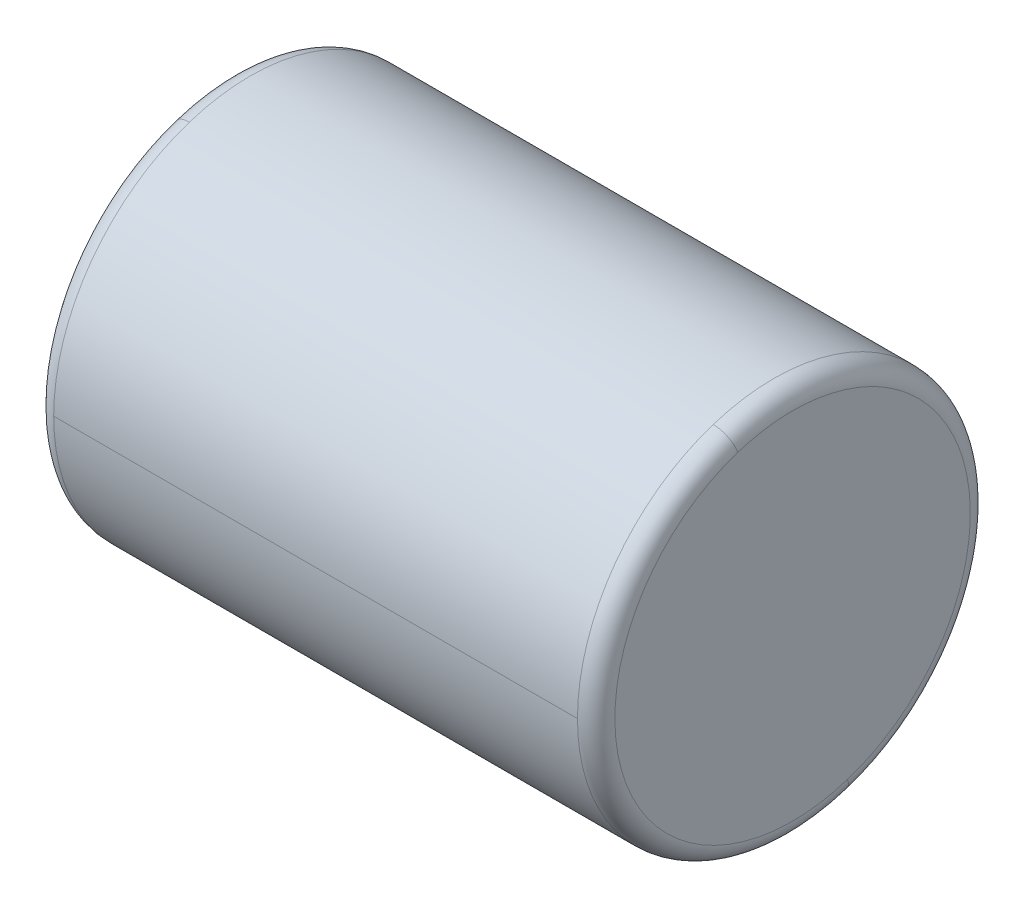
ISO-10303-21;
HEADER;
FILE_DESCRIPTION(('STEP AP214'),'2;1');
FILE_NAME('part.step','',(''),(''),'','','');
FILE_SCHEMA(('AUTOMOTIVE_DESIGN { 1 0 10303 214 1 1 1 1 }'));
ENDSEC;
DATA;
#1=APPLICATION_CONTEXT('core data for automotive mechanical design processes');
#2=APPLICATION_PROTOCOL_DEFINITION('international standard','automotive_design',2000,#1);
#3=PRODUCT_CONTEXT('',#1,'mechanical');
#4=PRODUCT('Part','Part','',(#3));
#5=PRODUCT_RELATED_PRODUCT_CATEGORY('part','',(#4));
#6=PRODUCT_DEFINITION_FORMATION('','',#4);
#7=PRODUCT_DEFINITION_CONTEXT('part definition',#1,'design');
#8=PRODUCT_DEFINITION('design','',#6,#7);
#9=PRODUCT_DEFINITION_SHAPE('','',#8);
#10=(LENGTH_UNIT() NAMED_UNIT(*) SI_UNIT(.MILLI.,.METRE.));
#11=(NAMED_UNIT(*) PLANE_ANGLE_UNIT() SI_UNIT($,.RADIAN.));
#12=(NAMED_UNIT(*) SI_UNIT($,.STERADIAN.) SOLID_ANGLE_UNIT());
#13=UNCERTAINTY_MEASURE_WITH_UNIT(LENGTH_MEASURE(1.E-05),#10,'distance_accuracy_value','');
#14=(GEOMETRIC_REPRESENTATION_CONTEXT(3) GLOBAL_UNCERTAINTY_ASSIGNED_CONTEXT((#13)) GLOBAL_UNIT_ASSIGNED_CONTEXT((#10,
#11,#12)) REPRESENTATION_CONTEXT('',''));
#15=CARTESIAN_POINT('',(0.,0.,0.));
#16=DIRECTION('',(0.,0.,1.));
#17=DIRECTION('',(1.,0.,0.));
#18=AXIS2_PLACEMENT_3D('',#15,#16,#17);
#19=CARTESIAN_POINT('',(3.5,21.3,0.));
#20=DIRECTION('',(1.,0.,0.));
#21=DIRECTION('',(0.,0.,-1.));
#22=AXIS2_PLACEMENT_3D('',#19,#20,#21);
#23=PLANE('',#22);
#24=CARTESIAN_POINT('',(3.5,24.3116789682677,0.978553815520581));
#25=CARTESIAN_POINT('',(3.5,24.2956684480541,1.02783268681269));
#26=CARTESIAN_POINT('',(3.5,24.2784464274029,1.07671781941379));
#27=CARTESIAN_POINT('',(3.5,24.2416253908425,1.17358455536198));
#28=CARTESIAN_POINT('',(3.5,24.2220263749333,1.22156615870908));
#29=CARTESIAN_POINT('',(3.5,24.1804973534747,1.31650978427726));
#30=CARTESIAN_POINT('',(3.5,24.1585673479251,1.36347180649835));
#31=CARTESIAN_POINT('',(3.5,24.1124295027428,1.4562632574427));
#32=CARTESIAN_POINT('',(3.5,24.08822166311,1.50209268616597));
#33=CARTESIAN_POINT('',(3.5,24.0375863816839,1.59250850998114));
#34=CARTESIAN_POINT('',(3.5,24.0111589398906,1.63709490507304));
#35=CARTESIAN_POINT('',(3.5,23.9561481434458,1.72491725794356));
#36=CARTESIAN_POINT('',(3.5,23.9275647887943,1.76815321572218));
#37=CARTESIAN_POINT('',(3.5,23.8683110202002,1.85317053238571));
#38=CARTESIAN_POINT('',(3.5,23.8376406062575,1.89495189127061));
#39=CARTESIAN_POINT('',(3.5,23.7742866084662,1.97695935582888));
#40=CARTESIAN_POINT('',(3.5,23.7416030246175,2.01718546150224));
#41=CARTESIAN_POINT('',(3.5,23.6743014241823,2.09598551125522));
#42=CARTESIAN_POINT('',(3.5,23.6396834075959,2.13455945533485));
#43=CARTESIAN_POINT('',(3.5,23.5685963396394,2.20996225393599));
#44=CARTESIAN_POINT('',(3.5,23.5321272882694,2.24679110845752));
#45=CARTESIAN_POINT('',(3.5,23.4574260078526,2.31861500399389));
#46=CARTESIAN_POINT('',(3.5,23.4191937788059,2.35361004500874));
#47=CARTESIAN_POINT('',(3.5,23.341058247833,2.42168200741601));
#48=CARTESIAN_POINT('',(3.5,23.3011549459067,2.45475892880844));
#49=CARTESIAN_POINT('',(3.5,23.2197733997219,2.51891496676917));
#50=CARTESIAN_POINT('',(3.5,23.1782951554632,2.54999408333748));
#51=CARTESIAN_POINT('',(3.5,23.0938636493377,2.61007963933617));
#52=CARTESIAN_POINT('',(3.5,23.0509103874708,2.63908607876656));
#53=CARTESIAN_POINT('',(3.5,22.9636323242986,2.69495640143612));
#54=CARTESIAN_POINT('',(3.5,22.9193075229933,2.72182028467528));
#55=CARTESIAN_POINT('',(3.5,22.8293931632732,2.77334077751468));
#56=CARTESIAN_POINT('',(3.5,22.7838036048584,2.79799738711491));
#57=CARTESIAN_POINT('',(3.5,22.6914695601585,2.84504393274425));
#58=CARTESIAN_POINT('',(3.5,22.6447250738735,2.86743386877336));
#59=CARTESIAN_POINT('',(3.5,22.550193784995,2.90989312794343));
#60=CARTESIAN_POINT('',(3.5,22.5024069824016,2.92996245108439));
#61=CARTESIAN_POINT('',(3.5,22.4059061834995,2.96773213572085));
#62=CARTESIAN_POINT('',(3.5,22.3571921871907,2.98543249721635));
#63=CARTESIAN_POINT('',(3.5,22.2589543571419,3.01842161684069));
#64=CARTESIAN_POINT('',(3.5,22.2094305234018,3.03371037496952));
#65=CARTESIAN_POINT('',(3.5,22.1096923257435,3.06183945590304));
#66=CARTESIAN_POINT('',(3.5,22.0594779618253,3.07467977870774));
#67=CARTESIAN_POINT('',(3.5,21.9584796746117,3.09788105553067));
#68=CARTESIAN_POINT('',(3.5,21.9076957513164,3.10824200954891));
#69=CARTESIAN_POINT('',(3.5,21.8056806882678,3.12645958835319));
#70=CARTESIAN_POINT('',(3.5,21.7544495485146,3.13431621313923));
#71=CARTESIAN_POINT('',(3.5,21.6516634728534,3.14750620618185));
#72=CARTESIAN_POINT('',(3.5,21.6001085369454,3.15283957443842));
#73=CARTESIAN_POINT('',(3.5,21.4967990693309,3.16097020587083));
#74=CARTESIAN_POINT('',(3.5,21.4450445376243,3.16376746904666));
#75=CARTESIAN_POINT('',(3.5,21.3414605596128,3.16681915146558));
#76=CARTESIAN_POINT('',(3.5,21.2896311133077,3.16707357070867));
#77=CARTESIAN_POINT('',(3.5,21.186022167775,3.16503895234385));
#78=CARTESIAN_POINT('',(3.5,21.1342426685473,3.16274991473595));
#79=CARTESIAN_POINT('',(3.5,21.0308583585184,3.15563389716126));
#80=CARTESIAN_POINT('',(3.5,20.979253547717,3.15080691719447));
#81=CARTESIAN_POINT('',(3.5,20.8763429350501,3.13862664351952));
#82=CARTESIAN_POINT('',(3.5,20.8250371331844,3.13127334981136));
#83=CARTESIAN_POINT('',(3.5,20.7228481385592,3.11405816338231));
#84=CARTESIAN_POINT('',(3.5,20.6719649457997,3.10419627066141));
#85=CARTESIAN_POINT('',(3.5,20.5707437514551,3.08198764437024));
#86=CARTESIAN_POINT('',(3.5,20.52040574987,3.06964091079996));
#87=CARTESIAN_POINT('',(3.5,20.420396206529,3.04249234717264));
#88=CARTESIAN_POINT('',(3.5,20.3707246647732,3.0276905171156));
#89=CARTESIAN_POINT('',(3.5,20.2721677041856,2.99566741941985));
#90=CARTESIAN_POINT('',(3.5,20.2232822853539,2.97844615178114));
#91=CARTESIAN_POINT('',(3.5,20.1264153398703,2.9416256664642));
#92=CARTESIAN_POINT('',(3.5,20.0784338132185,2.92202644878597));
#93=CARTESIAN_POINT('',(3.5,19.9834902437952,2.88049727962206));
#94=CARTESIAN_POINT('',(3.5,19.9365282010236,2.85856732813638));
#95=CARTESIAN_POINT('',(3.5,19.8437367350353,2.81242952253154));
#96=CARTESIAN_POINT('',(3.5,19.7979073118185,2.78822166841239));
#97=CARTESIAN_POINT('',(3.5,19.7074914920344,2.73758637638152));
#98=CARTESIAN_POINT('',(3.5,19.662905095467,2.71115893846981));
#99=CARTESIAN_POINT('',(3.5,19.5750827415164,2.65614814486654));
#100=CARTESIAN_POINT('',(3.5,19.5318467841331,2.62756478917499));
#101=CARTESIAN_POINT('',(3.5,19.446829467759,2.56831101981949));
#102=CARTESIAN_POINT('',(3.5,19.4050481087682,2.53764060615554));
#103=CARTESIAN_POINT('',(3.5,19.3230406441323,2.47428660856821));
#104=CARTESIAN_POINT('',(3.5,19.2828145384874,2.44160302464481));
#105=CARTESIAN_POINT('',(3.5,19.2040144887552,2.37430142415497));
#106=CARTESIAN_POINT('',(3.5,19.1654405446679,2.33968340758854));
#107=CARTESIAN_POINT('',(3.5,19.0900377460612,2.26859633964671));
#108=CARTESIAN_POINT('',(3.5,19.0532088915417,2.23212728827132));
#109=CARTESIAN_POINT('',(3.5,18.9813849960069,2.15742600785067));
#110=CARTESIAN_POINT('',(3.5,18.9463899549915,2.1191937788054));
#111=CARTESIAN_POINT('',(3.5,18.8783179925838,2.04105824783351));
#112=CARTESIAN_POINT('',(3.5,18.8452410711915,2.00115494590688));
#113=CARTESIAN_POINT('',(3.5,18.7810850332309,1.91977339972173));
#114=CARTESIAN_POINT('',(3.5,18.7500059166625,1.87829515546321));
#115=CARTESIAN_POINT('',(3.5,18.6899203606638,1.79386364933774));
#116=CARTESIAN_POINT('',(3.5,18.6609139212334,1.75091038747079));
#117=CARTESIAN_POINT('',(3.5,18.6050435985639,1.66363232429859));
#118=CARTESIAN_POINT('',(3.5,18.5781797153247,1.61930752299333));
#119=CARTESIAN_POINT('',(3.5,18.5266592224853,1.52939316327322));
#120=CARTESIAN_POINT('',(3.5,18.5020026128851,1.48380360485838));
#121=CARTESIAN_POINT('',(3.5,18.4549560672557,1.39146956015851));
#122=CARTESIAN_POINT('',(3.5,18.4325661312266,1.34472507387349));
#123=CARTESIAN_POINT('',(3.5,18.3901068720566,1.25019378499504));
#124=CARTESIAN_POINT('',(3.5,18.3700375489156,1.20240698240162));
#125=CARTESIAN_POINT('',(3.5,18.3322678642792,1.10590618349948));
#126=CARTESIAN_POINT('',(3.5,18.3145675027837,1.05719218719075));
#127=CARTESIAN_POINT('',(3.5,18.2815783831593,0.958954357141904));
#128=CARTESIAN_POINT('',(3.5,18.2662896250303,0.909430523401779));
#129=CARTESIAN_POINT('',(3.5,18.2381605440971,0.809692325743558));
#130=CARTESIAN_POINT('',(3.5,18.2253202212928,0.759477961825463));
#131=CARTESIAN_POINT('',(3.5,18.2021189444688,0.65847967461159));
#132=CARTESIAN_POINT('',(3.5,18.1917579904491,0.607695751315812));
#133=CARTESIAN_POINT('',(3.5,18.1735404116488,0.505680688268356));
#134=CARTESIAN_POINT('',(3.5,18.1656837868683,0.454449548516679));
#135=CARTESIAN_POINT('',(3.5,18.1524937938106,0.35166347285139));
#136=CARTESIAN_POINT('',(3.5,18.1471604255334,0.300108536937779));
#137=CARTESIAN_POINT('',(3.5,18.1390297941574,0.196799069338551));
#138=CARTESIAN_POINT('',(3.5,18.1362325310586,0.145044537652935));
#139=CARTESIAN_POINT('',(3.5,18.1331808484291,0.0414605595841703));
#140=CARTESIAN_POINT('',(3.5,18.1329264288983,-0.0103688867989791));
#141=CARTESIAN_POINT('',(3.5,18.1349610480492,-0.113977832118299));
#142=CARTESIAN_POINT('',(3.5,18.1372500867309,-0.16575733105447));
#143=CARTESIAN_POINT('',(3.5,18.1443661013719,-0.269141641879834));
#144=CARTESIAN_POINT('',(3.5,18.1491930773311,-0.320746453769028));
#145=CARTESIAN_POINT('',(3.5,18.1613733619549,-0.423657063463854));
#146=CARTESIAN_POINT('',(3.5,18.1687266706194,-0.474962861269486));
#147=CARTESIAN_POINT('',(3.5,18.1859418161869,-0.577151866986909));
#148=CARTESIAN_POINT('',(3.5,18.19580365309,-0.628035074898699));
#149=CARTESIAN_POINT('',(3.5,18.2180124318783,-0.729256227846476));
#150=CARTESIAN_POINT('',(3.5,18.2303593737636,-0.779594172882464));
#151=CARTESIAN_POINT('',(3.5,18.2575073682638,-0.879603870718502));
#152=CARTESIAN_POINT('',(3.5,18.2723084208787,-0.929275623518553));
#153=CARTESIAN_POINT('',(3.5,18.2883210317323,-0.97855381552057));
#154=B_SPLINE_CURVE_WITH_KNOTS('',3,(#24,#25,#26,#27,#28,#29,#30,#31,#32,#33,#34,#35,#36,#37,
#38,#39,#40,#41,#42,#43,#44,#45,#46,#47,#48,#49,#50,#51,#52,#53,#54,#55,#56,#57,#58,#59,#60,#61,
#62,#63,#64,#65,#66,#67,#68,#69,#70,#71,#72,#73,#74,#75,#76,#77,#78,#79,#80,#81,#82,#83,#84,#85,
#86,#87,#88,#89,#90,#91,#92,#93,#94,#95,#96,#97,#98,#99,#100,#101,#102,#103,#104,#105,#106,#107,
#108,#109,#110,#111,#112,#113,#114,#115,#116,#117,#118,#119,#120,#121,#122,#123,#124,#125,#126,
#127,#128,#129,#130,#131,#132,#133,#134,#135,#136,#137,#138,#139,#140,#141,#142,#143,#144,#145,
#146,#147,#148,#149,#150,#151,#152,#153),.UNSPECIFIED.,.F.,.F.,(4,2,2,2,2,2,2,2,2,2,2,2,2,2,2,2,
2,2,2,2,2,2,2,2,2,2,2,2,2,2,2,2,2,2,2,2,2,2,2,2,2,2,2,2,2,2,2,2,2,2,2,2,2,2,2,2,2,2,2,2,2,2,2,2,
4),(0.,0.155427780645098,0.310855561290195,0.466283341935292,0.62171112258039,0.777138903225486,
0.932566683870585,1.08799446451568,1.24342224516078,1.39885002580588,1.55427780645097,
1.70970558709607,1.86513336774117,2.02056114838627,2.17598892903136,2.33141670967646,
2.48684449032156,2.64227227096665,2.79770005161175,2.95312783225685,3.10855561290195,
3.26398339354704,3.41941117419214,3.57483895483724,3.73026673548234,3.88569451612744,
4.04112229677253,4.19655007741763,4.35197785806272,4.50740563870782,4.66283341935292,
4.81826119999802,4.97368898064311,5.12911676128821,5.28454454193331,5.4399723225784,
5.59540010322351,5.7508278838686,5.9062556645137,6.0616834451588,6.21711122580389,
6.37253900644899,6.52796678709409,6.68339456773919,6.83882234838428,6.99425012902938,
7.14967790967448,7.30510569031957,7.46053347096467,7.61596125160977,7.77138903225487,
7.92681681289996,8.08224459354506,8.23767237419016,8.39310015483526,8.54852793548035,
8.70395571612545,8.85938349677055,9.01481127741565,9.17023905806074,9.32566683870584,
9.48109461935094,9.63652239999603,9.79195018064113,9.94737796128623),.UNSPECIFIED.);
#155=CARTESIAN_POINT('',(3.5,24.3116789682677,0.978553815520581));
#156=VERTEX_POINT('',#155);
#157=CARTESIAN_POINT('',(3.5,18.2883210317323,-0.97855381552058));
#158=VERTEX_POINT('',#157);
#159=EDGE_CURVE('E11',#156,#158,#154,.T.);
#160=ORIENTED_EDGE('',*,*,#159,.F.);
#161=CARTESIAN_POINT('',(3.5,18.2883210317323,-0.978553815520581));
#162=CARTESIAN_POINT('',(3.5,18.3043315519459,-1.02783268681269));
#163=CARTESIAN_POINT('',(3.5,18.3215535725971,-1.07671781941379));
#164=CARTESIAN_POINT('',(3.5,18.3583746091575,-1.17358455536198));
#165=CARTESIAN_POINT('',(3.5,18.3779736250667,-1.22156615870908));
#166=CARTESIAN_POINT('',(3.5,18.4195026465253,-1.31650978427726));
#167=CARTESIAN_POINT('',(3.5,18.4414326520749,-1.36347180649835));
#168=CARTESIAN_POINT('',(3.5,18.4875704972572,-1.4562632574427));
#169=CARTESIAN_POINT('',(3.5,18.51177833689,-1.50209268616597));
#170=CARTESIAN_POINT('',(3.5,18.5624136183161,-1.59250850998114));
#171=CARTESIAN_POINT('',(3.5,18.5888410601094,-1.63709490507304));
#172=CARTESIAN_POINT('',(3.5,18.6438518565542,-1.72491725794356));
#173=CARTESIAN_POINT('',(3.5,18.6724352112057,-1.76815321572218));
#174=CARTESIAN_POINT('',(3.5,18.7316889797998,-1.85317053238571));
#175=CARTESIAN_POINT('',(3.5,18.7623593937425,-1.89495189127061));
#176=CARTESIAN_POINT('',(3.5,18.8257133915338,-1.97695935582888));
#177=CARTESIAN_POINT('',(3.5,18.8583969753825,-2.01718546150224));
#178=CARTESIAN_POINT('',(3.5,18.9256985758177,-2.09598551125522));
#179=CARTESIAN_POINT('',(3.5,18.9603165924041,-2.13455945533484));
#180=CARTESIAN_POINT('',(3.5,19.0314036603606,-2.20996225393599));
#181=CARTESIAN_POINT('',(3.5,19.0678727117306,-2.24679110845752));
#182=CARTESIAN_POINT('',(3.5,19.1425739921474,-2.31861500399389));
#183=CARTESIAN_POINT('',(3.5,19.1808062211941,-2.35361004500874));
#184=CARTESIAN_POINT('',(3.5,19.258941752167,-2.42168200741601));
#185=CARTESIAN_POINT('',(3.5,19.2988450540933,-2.45475892880844));
#186=CARTESIAN_POINT('',(3.5,19.3802266002781,-2.51891496676917));
#187=CARTESIAN_POINT('',(3.5,19.4217048445368,-2.54999408333747));
#188=CARTESIAN_POINT('',(3.5,19.5061363506623,-2.61007963933617));
#189=CARTESIAN_POINT('',(3.5,19.5490896125292,-2.63908607876656));
#190=CARTESIAN_POINT('',(3.5,19.6363676757014,-2.69495640143612));
#191=CARTESIAN_POINT('',(3.5,19.6806924770067,-2.72182028467528));
#192=CARTESIAN_POINT('',(3.5,19.7706068367268,-2.77334077751468));
#193=CARTESIAN_POINT('',(3.5,19.8161963951416,-2.79799738711491));
#194=CARTESIAN_POINT('',(3.5,19.9085304398415,-2.84504393274425));
#195=CARTESIAN_POINT('',(3.5,19.9552749261265,-2.86743386877336));
#196=CARTESIAN_POINT('',(3.5,20.049806215005,-2.90989312794343));
#197=CARTESIAN_POINT('',(3.5,20.0975930175984,-2.92996245108439));
#198=CARTESIAN_POINT('',(3.5,20.1940938165005,-2.96773213572085));
#199=CARTESIAN_POINT('',(3.5,20.2428078128093,-2.98543249721635));
#200=CARTESIAN_POINT('',(3.5,20.3410456428581,-3.01842161684069));
#201=CARTESIAN_POINT('',(3.5,20.3905694765982,-3.03371037496952));
#202=CARTESIAN_POINT('',(3.5,20.4903076742565,-3.06183945590304));
#203=CARTESIAN_POINT('',(3.5,20.5405220381747,-3.07467977870774));
#204=CARTESIAN_POINT('',(3.5,20.6415203253883,-3.09788105553067));
#205=CARTESIAN_POINT('',(3.5,20.6923042486836,-3.10824200954891));
#206=CARTESIAN_POINT('',(3.5,20.7943193117322,-3.12645958835319));
#207=CARTESIAN_POINT('',(3.5,20.8455504514854,-3.13431621313923));
#208=CARTESIAN_POINT('',(3.5,20.9483365271466,-3.14750620618185));
#209=CARTESIAN_POINT('',(3.5,20.9998914630546,-3.15283957443842));
#210=CARTESIAN_POINT('',(3.5,21.1032009306691,-3.16097020587083));
#211=CARTESIAN_POINT('',(3.5,21.1549554623757,-3.16376746904666));
#212=CARTESIAN_POINT('',(3.5,21.2585394403872,-3.16681915146558));
#213=CARTESIAN_POINT('',(3.5,21.3103688866923,-3.16707357070867));
#214=CARTESIAN_POINT('',(3.5,21.413977832225,-3.16503895234385));
#215=CARTESIAN_POINT('',(3.5,21.4657573314527,-3.16274991473595));
#216=CARTESIAN_POINT('',(3.5,21.5691416414816,-3.15563389716126));
#217=CARTESIAN_POINT('',(3.5,21.620746452283,-3.15080691719447));
#218=CARTESIAN_POINT('',(3.5,21.7236570649499,-3.13862664351952));
#219=CARTESIAN_POINT('',(3.5,21.7749628668156,-3.13127334981136));
#220=CARTESIAN_POINT('',(3.5,21.8771518614408,-3.11405816338231));
#221=CARTESIAN_POINT('',(3.5,21.9280350542003,-3.10419627066141));
#222=CARTESIAN_POINT('',(3.5,22.0292562485449,-3.08198764437024));
#223=CARTESIAN_POINT('',(3.5,22.07959425013,-3.06964091079996));
#224=CARTESIAN_POINT('',(3.5,22.179603793471,-3.04249234717264));
#225=CARTESIAN_POINT('',(3.5,22.2292753352268,-3.0276905171156));
#226=CARTESIAN_POINT('',(3.5,22.3278322958144,-2.99566741941985));
#227=CARTESIAN_POINT('',(3.5,22.3767177146461,-2.97844615178114));
#228=CARTESIAN_POINT('',(3.5,22.4735846601297,-2.9416256664642));
#229=CARTESIAN_POINT('',(3.5,22.5215661867815,-2.92202644878597));
#230=CARTESIAN_POINT('',(3.5,22.6165097562048,-2.88049727962206));
#231=CARTESIAN_POINT('',(3.5,22.6634717989764,-2.85856732813638));
#232=CARTESIAN_POINT('',(3.5,22.7562632649647,-2.81242952253154));
#233=CARTESIAN_POINT('',(3.5,22.8020926881815,-2.78822166841239));
#234=CARTESIAN_POINT('',(3.5,22.8925085079656,-2.73758637638152));
#235=CARTESIAN_POINT('',(3.5,22.937094904533,-2.71115893846981));
#236=CARTESIAN_POINT('',(3.5,23.0249172584836,-2.65614814486655));
#237=CARTESIAN_POINT('',(3.5,23.0681532158669,-2.62756478917499));
#238=CARTESIAN_POINT('',(3.5,23.153170532241,-2.56831101981949));
#239=CARTESIAN_POINT('',(3.5,23.1949518912318,-2.53764060615555));
#240=CARTESIAN_POINT('',(3.5,23.2769593558676,-2.47428660856821));
#241=CARTESIAN_POINT('',(3.5,23.3171854615126,-2.44160302464481));
#242=CARTESIAN_POINT('',(3.5,23.3959855112448,-2.37430142415498));
#243=CARTESIAN_POINT('',(3.5,23.434559455332,-2.33968340758854));
#244=CARTESIAN_POINT('',(3.5,23.5099622539388,-2.26859633964671));
#245=CARTESIAN_POINT('',(3.5,23.5467911084583,-2.23212728827132));
#246=CARTESIAN_POINT('',(3.5,23.6186150039931,-2.15742600785067));
#247=CARTESIAN_POINT('',(3.5,23.6536100450085,-2.1191937788054));
#248=CARTESIAN_POINT('',(3.5,23.7216820074162,-2.04105824783351));
#249=CARTESIAN_POINT('',(3.5,23.7547589288085,-2.00115494590689));
#250=CARTESIAN_POINT('',(3.5,23.8189149667691,-1.91977339972174));
#251=CARTESIAN_POINT('',(3.5,23.8499940833374,-1.87829515546321));
#252=CARTESIAN_POINT('',(3.5,23.9100796393362,-1.79386364933774));
#253=CARTESIAN_POINT('',(3.5,23.9390860787666,-1.7509103874708));
#254=CARTESIAN_POINT('',(3.5,23.9949564014361,-1.66363232429859));
#255=CARTESIAN_POINT('',(3.5,24.0218202846753,-1.61930752299333));
#256=CARTESIAN_POINT('',(3.5,24.0733407775147,-1.52939316327323));
#257=CARTESIAN_POINT('',(3.5,24.0979973871149,-1.48380360485839));
#258=CARTESIAN_POINT('',(3.5,24.1450439327442,-1.39146956015852));
#259=CARTESIAN_POINT('',(3.5,24.1674338687734,-1.34472507387349));
#260=CARTESIAN_POINT('',(3.5,24.2098931279434,-1.25019378499504));
#261=CARTESIAN_POINT('',(3.5,24.2299624510844,-1.20240698240162));
#262=CARTESIAN_POINT('',(3.5,24.2677321357208,-1.10590618349948));
#263=CARTESIAN_POINT('',(3.5,24.2854324972163,-1.05719218719076));
#264=CARTESIAN_POINT('',(3.5,24.3184216168407,-0.958954357141908));
#265=CARTESIAN_POINT('',(3.5,24.3337103749697,-0.909430523401784));
#266=CARTESIAN_POINT('',(3.5,24.3618394559029,-0.809692325743563));
#267=CARTESIAN_POINT('',(3.5,24.3746797787072,-0.759477961825467));
#268=CARTESIAN_POINT('',(3.5,24.3978810555312,-0.658479674611594));
#269=CARTESIAN_POINT('',(3.5,24.4082420095509,-0.607695751315816));
#270=CARTESIAN_POINT('',(3.5,24.4264595883512,-0.505680688268361));
#271=CARTESIAN_POINT('',(3.5,24.4343162131317,-0.454449548516683));
#272=CARTESIAN_POINT('',(3.5,24.4475062061894,-0.351663472851395));
#273=CARTESIAN_POINT('',(3.5,24.4528395744666,-0.300108536937784));
#274=CARTESIAN_POINT('',(3.5,24.4609702058426,-0.196799069338557));
#275=CARTESIAN_POINT('',(3.5,24.4637674689413,-0.145044537652941));
#276=CARTESIAN_POINT('',(3.5,24.4668191515709,-0.0414605595841764));
#277=CARTESIAN_POINT('',(3.5,24.4670735711017,0.010368886798973));
#278=CARTESIAN_POINT('',(3.5,24.4650389519508,0.113977832118293));
#279=CARTESIAN_POINT('',(3.5,24.4627499132691,0.165757331054464));
#280=CARTESIAN_POINT('',(3.5,24.4556338986281,0.269141641879828));
#281=CARTESIAN_POINT('',(3.5,24.4508069226689,0.320746453769022));
#282=CARTESIAN_POINT('',(3.5,24.4386266380451,0.423657063463849));
#283=CARTESIAN_POINT('',(3.5,24.4312733293806,0.474962861269483));
#284=CARTESIAN_POINT('',(3.5,24.4140581838131,0.577151866986906));
#285=CARTESIAN_POINT('',(3.5,24.40419634691,0.628035074898696));
#286=CARTESIAN_POINT('',(3.5,24.3819875681217,0.729256227846473));
#287=CARTESIAN_POINT('',(3.5,24.3696406262364,0.77959417288246));
#288=CARTESIAN_POINT('',(3.5,24.3424926317362,0.879603870718498));
#289=CARTESIAN_POINT('',(3.5,24.3276915791213,0.929275623518549));
#290=CARTESIAN_POINT('',(3.5,24.3116789682677,0.978553815520564));
#291=B_SPLINE_CURVE_WITH_KNOTS('',3,(#161,#162,#163,#164,#165,#166,#167,#168,#169,#170,#171,
#172,#173,#174,#175,#176,#177,#178,#179,#180,#181,#182,#183,#184,#185,#186,#187,#188,#189,#190,
#191,#192,#193,#194,#195,#196,#197,#198,#199,#200,#201,#202,#203,#204,#205,#206,#207,#208,#209,
#210,#211,#212,#213,#214,#215,#216,#217,#218,#219,#220,#221,#222,#223,#224,#225,#226,#227,#228,
#229,#230,#231,#232,#233,#234,#235,#236,#237,#238,#239,#240,#241,#242,#243,#244,#245,#246,#247,
#248,#249,#250,#251,#252,#253,#254,#255,#256,#257,#258,#259,#260,#261,#262,#263,#264,#265,#266,
#267,#268,#269,#270,#271,#272,#273,#274,#275,#276,#277,#278,#279,#280,#281,#282,#283,#284,#285,
#286,#287,#288,#289,#290),.UNSPECIFIED.,.F.,.F.,(4,2,2,2,2,2,2,2,2,2,2,2,2,2,2,2,2,2,2,2,2,2,2,
2,2,2,2,2,2,2,2,2,2,2,2,2,2,2,2,2,2,2,2,2,2,2,2,2,2,2,2,2,2,2,2,2,2,2,2,2,2,2,2,2,4),(0.,
0.155427780645098,0.310855561290195,0.466283341935291,0.62171112258039,0.777138903225486,
0.932566683870583,1.08799446451568,1.24342224516078,1.39885002580588,1.55427780645097,
1.70970558709607,1.86513336774117,2.02056114838627,2.17598892903136,2.33141670967646,
2.48684449032156,2.64227227096665,2.79770005161175,2.95312783225685,3.10855561290195,
3.26398339354704,3.41941117419214,3.57483895483724,3.73026673548233,3.88569451612743,
4.04112229677253,4.19655007741763,4.35197785806272,4.50740563870782,4.66283341935292,
4.81826119999802,4.97368898064311,5.12911676128821,5.28454454193331,5.43997232257841,
5.5954001032235,5.7508278838686,5.9062556645137,6.0616834451588,6.21711122580389,
6.37253900644899,6.52796678709409,6.68339456773918,6.83882234838428,6.99425012902938,
7.14967790967447,7.30510569031957,7.46053347096467,7.61596125160977,7.77138903225486,
7.92681681289996,8.08224459354506,8.23767237419015,8.39310015483525,8.54852793548035,
8.70395571612544,8.85938349677054,9.01481127741564,9.17023905806074,9.32566683870583,
9.48109461935093,9.63652239999603,9.79195018064113,9.94737796128622),.UNSPECIFIED.);
#292=EDGE_CURVE('E26',#158,#156,#291,.T.);
#293=ORIENTED_EDGE('',*,*,#292,.F.);
#294=EDGE_LOOP('',(#160,#293));
#295=FACE_BOUND('',#294,.T.);
#296=ADVANCED_FACE('F17',(#295),#23,.F.);
#297=CARTESIAN_POINT('',(3.83333333333362,21.3,0.));
#298=DIRECTION('',(1.,0.,0.));
#299=DIRECTION('',(0.,-0.309016994374947,0.951056516295154));
#300=AXIS2_PLACEMENT_3D('',#297,#298,#299);
#301=TOROIDAL_SURFACE('',#300,3.16666666666639,0.333333333333613);
#302=CARTESIAN_POINT('',(3.83333333333362,18.2883210317323,-0.978553815520581));
#303=DIRECTION('',(0.,0.309016994374946,-0.951056516295154));
#304=DIRECTION('',(-9.47242284609388E-13,-0.951056516295154,-0.309016994374946));
#305=AXIS2_PLACEMENT_3D('',#302,#303,#304);
#306=CIRCLE('',#305,0.333333333333613);
#307=CARTESIAN_POINT('',(3.8333333333333,17.971302192967,-1.08155948031232));
#308=VERTEX_POINT('',#307);
#309=EDGE_CURVE('E139',#308,#158,#306,.T.);
#310=ORIENTED_EDGE('',*,*,#309,.T.);
#311=ORIENTED_EDGE('',*,*,#292,.T.);
#312=CARTESIAN_POINT('',(3.83333333333362,24.3116789682677,0.978553815520581));
#313=DIRECTION('',(0.,-0.309016994374947,0.951056516295154));
#314=DIRECTION('',(-9.45910016979839E-13,0.951056516295154,0.309016994374947));
#315=AXIS2_PLACEMENT_3D('',#312,#313,#314);
#316=CIRCLE('',#315,0.333333333333613);
#317=CARTESIAN_POINT('',(3.8333333333333,24.628697807033,1.08155948031232));
#318=VERTEX_POINT('',#317);
#319=EDGE_CURVE('E135',#318,#156,#316,.T.);
#320=ORIENTED_EDGE('',*,*,#319,.F.);
#321=CARTESIAN_POINT('',(3.8333333333333,21.3,0.));
#322=DIRECTION('',(1.,0.,0.));
#323=DIRECTION('',(0.,0.,-1.));
#324=AXIS2_PLACEMENT_3D('',#321,#322,#323);
#325=CIRCLE('',#324,3.5);
#326=CARTESIAN_POINT('',(3.8333333333333,21.3,-3.5));
#327=VERTEX_POINT('',#326);
#328=EDGE_CURVE('E130',#327,#318,#325,.T.);
#329=ORIENTED_EDGE('',*,*,#328,.F.);
#330=CARTESIAN_POINT('',(3.8333333333333,21.3,0.));
#331=DIRECTION('',(1.,0.,0.));
#332=DIRECTION('',(0.,0.,-1.));
#333=AXIS2_PLACEMENT_3D('',#330,#331,#332);
#334=CIRCLE('',#333,3.5);
#335=EDGE_CURVE('E125',#308,#327,#334,.T.);
#336=ORIENTED_EDGE('',*,*,#335,.F.);
#337=EDGE_LOOP('',(#310,#311,#320,#329,#336));
#338=FACE_BOUND('',#337,.T.);
#339=ADVANCED_FACE('F146',(#338),#301,.T.);
#340=CARTESIAN_POINT('',(13.5,21.3,0.));
#341=DIRECTION('',(1.,0.,0.));
#342=DIRECTION('',(0.,1.,0.));
#343=AXIS2_PLACEMENT_3D('',#340,#341,#342);
#344=CYLINDRICAL_SURFACE('',#343,3.5);
#345=DIRECTION('',(1.,0.,0.));
#346=VECTOR('',#345,1.);
#347=CARTESIAN_POINT('',(3.8333333333333,21.3,3.5));
#348=LINE('',#347,#346);
#349=CARTESIAN_POINT('',(3.8333333333333,21.3,3.5));
#350=VERTEX_POINT('',#349);
#351=CARTESIAN_POINT('',(13.166666666667,21.3,3.5));
#352=VERTEX_POINT('',#351);
#353=EDGE_CURVE('E92',#350,#352,#348,.T.);
#354=ORIENTED_EDGE('',*,*,#353,.F.);
#355=CARTESIAN_POINT('',(3.8333333333333,21.3,0.));
#356=DIRECTION('',(1.,0.,0.));
#357=DIRECTION('',(0.,0.,-1.));
#358=AXIS2_PLACEMENT_3D('',#355,#356,#357);
#359=CIRCLE('',#358,3.5);
#360=EDGE_CURVE('E117',#350,#308,#359,.T.);
#361=ORIENTED_EDGE('',*,*,#360,.T.);
#362=ORIENTED_EDGE('',*,*,#335,.T.);
#363=DIRECTION('',(1.,0.,0.));
#364=VECTOR('',#363,1.);
#365=CARTESIAN_POINT('',(3.8333333333333,21.3,-3.5));
#366=LINE('',#365,#364);
#367=CARTESIAN_POINT('',(13.166666666667,21.3,-3.5));
#368=VERTEX_POINT('',#367);
#369=EDGE_CURVE('E113',#327,#368,#366,.T.);
#370=ORIENTED_EDGE('',*,*,#369,.T.);
#371=CARTESIAN_POINT('',(13.166666666667,21.3,0.));
#372=DIRECTION('',(1.,0.,0.));
#373=DIRECTION('',(0.,0.,-1.));
#374=AXIS2_PLACEMENT_3D('',#371,#372,#373);
#375=CIRCLE('',#374,3.5);
#376=CARTESIAN_POINT('',(13.166666666667,17.971302192967,-1.08155948031232));
#377=VERTEX_POINT('',#376);
#378=EDGE_CURVE('E84',#377,#368,#375,.T.);
#379=ORIENTED_EDGE('',*,*,#378,.F.);
#380=CARTESIAN_POINT('',(13.166666666667,21.3,0.));
#381=DIRECTION('',(1.,0.,0.));
#382=DIRECTION('',(0.,0.,-1.));
#383=AXIS2_PLACEMENT_3D('',#380,#381,#382);
#384=CIRCLE('',#383,3.5);
#385=EDGE_CURVE('E106',#352,#377,#384,.T.);
#386=ORIENTED_EDGE('',*,*,#385,.F.);
#387=EDGE_LOOP('',(#354,#361,#362,#370,#379,#386));
#388=FACE_BOUND('',#387,.T.);
#389=ADVANCED_FACE('F155',(#388),#344,.T.);
#390=CARTESIAN_POINT('',(13.166666666666,21.3,0.));
#391=DIRECTION('',(1.,0.,0.));
#392=DIRECTION('',(0.,0.309016994374947,-0.951056516295154));
#393=AXIS2_PLACEMENT_3D('',#390,#391,#392);
#394=TOROIDAL_SURFACE('',#393,3.16666666666605,0.333333333333956);
#395=CARTESIAN_POINT('',(13.166666666666,18.2883210317326,-0.978553815520476));
#396=DIRECTION('',(0.,0.309016994374947,-0.951056516295154));
#397=DIRECTION('',(1.,0.,0.));
#398=AXIS2_PLACEMENT_3D('',#395,#396,#397);
#399=CIRCLE('',#398,0.333333333333956);
#400=CARTESIAN_POINT('',(13.5,18.2883210317326,-0.978553815520476));
#401=VERTEX_POINT('',#400);
#402=EDGE_CURVE('E102',#401,#377,#399,.T.);
#403=ORIENTED_EDGE('',*,*,#402,.F.);
#404=CARTESIAN_POINT('',(13.5,21.3,0.));
#405=DIRECTION('',(1.,0.,0.));
#406=DIRECTION('',(0.,0.,-1.));
#407=AXIS2_PLACEMENT_3D('',#404,#405,#406);
#408=CIRCLE('',#407,3.166666666667);
#409=CARTESIAN_POINT('',(13.5,24.3116789682674,0.978553815520476));
#410=VERTEX_POINT('',#409);
#411=EDGE_CURVE('E74',#410,#401,#408,.T.);
#412=ORIENTED_EDGE('',*,*,#411,.F.);
#413=CARTESIAN_POINT('',(13.166666666666,24.3116789682674,0.978553815520476));
#414=DIRECTION('',(0.,-0.309016994374947,0.951056516295154));
#415=DIRECTION('',(1.,0.,0.));
#416=AXIS2_PLACEMENT_3D('',#413,#414,#415);
#417=CIRCLE('',#416,0.333333333333956);
#418=CARTESIAN_POINT('',(13.166666666667,24.628697807033,1.08155948031232));
#419=VERTEX_POINT('',#418);
#420=EDGE_CURVE('E67',#410,#419,#417,.T.);
#421=ORIENTED_EDGE('',*,*,#420,.T.);
#422=CARTESIAN_POINT('',(13.166666666667,21.3,0.));
#423=DIRECTION('',(1.,0.,0.));
#424=DIRECTION('',(0.,0.,-1.));
#425=AXIS2_PLACEMENT_3D('',#422,#423,#424);
#426=CIRCLE('',#425,3.5);
#427=EDGE_CURVE('E72',#419,#352,#426,.T.);
#428=ORIENTED_EDGE('',*,*,#427,.T.);
#429=ORIENTED_EDGE('',*,*,#385,.T.);
#430=EDGE_LOOP('',(#403,#412,#421,#428,#429));
#431=FACE_BOUND('',#430,.T.);
#432=ADVANCED_FACE('F69',(#431),#394,.T.);
#433=CARTESIAN_POINT('',(13.5,21.3,0.));
#434=DIRECTION('',(1.,0.,0.));
#435=DIRECTION('',(0.,-1.,0.));
#436=AXIS2_PLACEMENT_3D('',#433,#434,#435);
#437=CYLINDRICAL_SURFACE('',#436,3.5);
#438=ORIENTED_EDGE('',*,*,#353,.T.);
#439=ORIENTED_EDGE('',*,*,#427,.F.);
#440=CARTESIAN_POINT('',(13.166666666667,21.3,0.));
#441=DIRECTION('',(1.,0.,0.));
#442=DIRECTION('',(0.,0.,-1.));
#443=AXIS2_PLACEMENT_3D('',#440,#441,#442);
#444=CIRCLE('',#443,3.5);
#445=EDGE_CURVE('E81',#368,#419,#444,.T.);
#446=ORIENTED_EDGE('',*,*,#445,.F.);
#447=ORIENTED_EDGE('',*,*,#369,.F.);
#448=ORIENTED_EDGE('',*,*,#328,.T.);
#449=CARTESIAN_POINT('',(3.8333333333333,21.3,0.));
#450=DIRECTION('',(1.,0.,0.));
#451=DIRECTION('',(0.,0.,-1.));
#452=AXIS2_PLACEMENT_3D('',#449,#450,#451);
#453=CIRCLE('',#452,3.5);
#454=EDGE_CURVE('E87',#318,#350,#453,.T.);
#455=ORIENTED_EDGE('',*,*,#454,.T.);
#456=EDGE_LOOP('',(#438,#439,#446,#447,#448,#455));
#457=FACE_BOUND('',#456,.T.);
#458=ADVANCED_FACE('F90',(#457),#437,.T.);
#459=CARTESIAN_POINT('',(3.83333333333362,21.3,0.));
#460=DIRECTION('',(1.,0.,0.));
#461=DIRECTION('',(0.,0.309016994374947,-0.951056516295154));
#462=AXIS2_PLACEMENT_3D('',#459,#460,#461);
#463=TOROIDAL_SURFACE('',#462,3.16666666666639,0.333333333333613);
#464=ORIENTED_EDGE('',*,*,#309,.F.);
#465=ORIENTED_EDGE('',*,*,#360,.F.);
#466=ORIENTED_EDGE('',*,*,#454,.F.);
#467=ORIENTED_EDGE('',*,*,#319,.T.);
#468=ORIENTED_EDGE('',*,*,#159,.T.);
#469=EDGE_LOOP('',(#464,#465,#466,#467,#468));
#470=FACE_BOUND('',#469,.T.);
#471=ADVANCED_FACE('F164',(#470),#463,.T.);
#472=CARTESIAN_POINT('',(13.166666666666,21.3,0.));
#473=DIRECTION('',(1.,0.,0.));
#474=DIRECTION('',(0.,-0.309016994374947,0.951056516295154));
#475=AXIS2_PLACEMENT_3D('',#472,#473,#474);
#476=TOROIDAL_SURFACE('',#475,3.16666666666605,0.333333333333956);
#477=ORIENTED_EDGE('',*,*,#402,.T.);
#478=ORIENTED_EDGE('',*,*,#378,.T.);
#479=ORIENTED_EDGE('',*,*,#445,.T.);
#480=ORIENTED_EDGE('',*,*,#420,.F.);
#481=CARTESIAN_POINT('',(13.5,18.2883210317317,-0.97855381552077));
#482=CARTESIAN_POINT('',(13.5,18.5960309302227,-1.92427993190453));
#483=CARTESIAN_POINT('',(13.5,19.2734678107102,-2.75187301968216));
#484=CARTESIAN_POINT('',(13.5,20.265430372305,-3.2560161260253));
#485=CARTESIAN_POINT('',(13.5,22.3989811095023,-3.38231606838171));
#486=CARTESIAN_POINT('',(13.5,24.0508226707736,-2.02606761028449));
#487=CARTESIAN_POINT('',(13.5,24.557009357934,-1.03514630512425));
#488=CARTESIAN_POINT('',(13.5,24.6186202949699,0.0325779750246395));
#489=CARTESIAN_POINT('',(13.5,24.3116789682683,0.978553815520769));
#490=B_SPLINE_CURVE_WITH_KNOTS('',5,(#481,#482,#483,#484,#485,#486,#487,#488,#489),
.UNSPECIFIED.,.F.,.F.,(6,3,6),(0.,1.5707963267949,3.14159265358979),.UNSPECIFIED.);
#491=EDGE_CURVE('E185',#401,#410,#490,.T.);
#492=ORIENTED_EDGE('',*,*,#491,.F.);
#493=EDGE_LOOP('',(#477,#478,#479,#480,#492));
#494=FACE_BOUND('',#493,.T.);
#495=ADVANCED_FACE('F83',(#494),#476,.T.);
#496=CARTESIAN_POINT('',(13.5,24.466666666667,0.));
#497=DIRECTION('',(-1.,0.,0.));
#498=DIRECTION('',(0.,0.,1.));
#499=AXIS2_PLACEMENT_3D('',#496,#497,#498);
#500=PLANE('',#499);
#501=ORIENTED_EDGE('',*,*,#491,.T.);
#502=ORIENTED_EDGE('',*,*,#411,.T.);
#503=EDGE_LOOP('',(#501,#502));
#504=FACE_BOUND('',#503,.T.);
#505=ADVANCED_FACE('F191',(#504),#500,.F.);
#506=CLOSED_SHELL('',(#296,#339,#389,#432,#458,#471,#495,#505));
#507=MANIFOLD_SOLID_BREP('B1',#506);
#508=ADVANCED_BREP_SHAPE_REPRESENTATION('',(#18,#507),#14);
#509=SHAPE_DEFINITION_REPRESENTATION(#9,#508);
ENDSEC;
END-ISO-10303-21;
